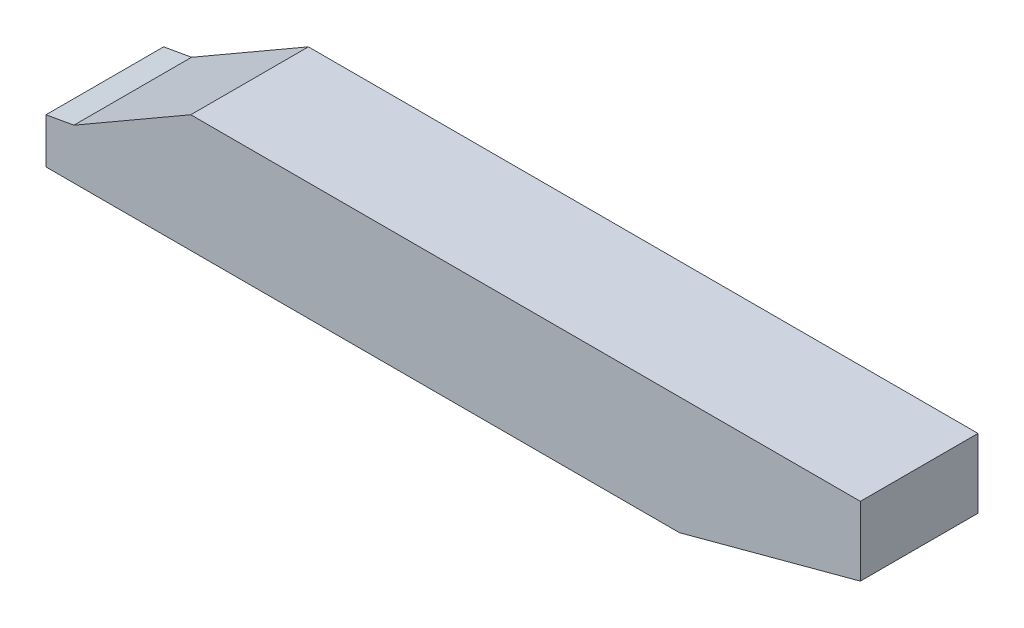
ISO-10303-21;
HEADER;
FILE_DESCRIPTION(('STEP AP214'),'2;1');
FILE_NAME('part.step','',(''),(''),'','','');
FILE_SCHEMA(('AUTOMOTIVE_DESIGN { 1 0 10303 214 1 1 1 1 }'));
ENDSEC;
DATA;
#1=APPLICATION_CONTEXT('core data for automotive mechanical design processes');
#2=APPLICATION_PROTOCOL_DEFINITION('international standard','automotive_design',2000,#1);
#3=PRODUCT_CONTEXT('',#1,'mechanical');
#4=PRODUCT('Part','Part','',(#3));
#5=PRODUCT_RELATED_PRODUCT_CATEGORY('part','',(#4));
#6=PRODUCT_DEFINITION_FORMATION('','',#4);
#7=PRODUCT_DEFINITION_CONTEXT('part definition',#1,'design');
#8=PRODUCT_DEFINITION('design','',#6,#7);
#9=PRODUCT_DEFINITION_SHAPE('','',#8);
#10=(LENGTH_UNIT() NAMED_UNIT(*) SI_UNIT(.MILLI.,.METRE.));
#11=(NAMED_UNIT(*) PLANE_ANGLE_UNIT() SI_UNIT($,.RADIAN.));
#12=(NAMED_UNIT(*) SI_UNIT($,.STERADIAN.) SOLID_ANGLE_UNIT());
#13=UNCERTAINTY_MEASURE_WITH_UNIT(LENGTH_MEASURE(1.E-05),#10,'distance_accuracy_value','');
#14=(GEOMETRIC_REPRESENTATION_CONTEXT(3) GLOBAL_UNCERTAINTY_ASSIGNED_CONTEXT((#13)) GLOBAL_UNIT_ASSIGNED_CONTEXT((#10,
#11,#12)) REPRESENTATION_CONTEXT('',''));
#15=CARTESIAN_POINT('',(0.,0.,0.));
#16=DIRECTION('',(0.,0.,1.));
#17=DIRECTION('',(1.,0.,0.));
#18=AXIS2_PLACEMENT_3D('',#15,#16,#17);
#19=CARTESIAN_POINT('',(700.,0.,65.));
#20=DIRECTION('',(0.,1.,0.));
#21=DIRECTION('',(0.,0.,1.));
#22=AXIS2_PLACEMENT_3D('',#19,#20,#21);
#23=PLANE('',#22);
#24=DIRECTION('',(1.,0.,0.));
#25=VECTOR('',#24,1.);
#26=CARTESIAN_POINT('',(700.,0.,-65.));
#27=LINE('',#26,#25);
#28=CARTESIAN_POINT('',(0.,0.,-65.));
#29=VERTEX_POINT('',#28);
#30=CARTESIAN_POINT('',(700.,0.,-65.));
#31=VERTEX_POINT('',#30);
#32=EDGE_CURVE('E199',#29,#31,#27,.T.);
#33=ORIENTED_EDGE('',*,*,#32,.T.);
#34=DIRECTION('',(0.,0.,-1.));
#35=VECTOR('',#34,1.);
#36=CARTESIAN_POINT('',(700.,0.,65.));
#37=LINE('',#36,#35);
#38=CARTESIAN_POINT('',(700.,0.,65.));
#39=VERTEX_POINT('',#38);
#40=EDGE_CURVE('E234',#39,#31,#37,.T.);
#41=ORIENTED_EDGE('',*,*,#40,.F.);
#42=DIRECTION('',(1.,0.,0.));
#43=VECTOR('',#42,1.);
#44=CARTESIAN_POINT('',(700.,0.,65.));
#45=LINE('',#44,#43);
#46=CARTESIAN_POINT('',(0.,0.,65.));
#47=VERTEX_POINT('',#46);
#48=EDGE_CURVE('E219',#47,#39,#45,.T.);
#49=ORIENTED_EDGE('',*,*,#48,.F.);
#50=DIRECTION('',(0.,0.,-1.));
#51=VECTOR('',#50,1.);
#52=CARTESIAN_POINT('',(0.,0.,65.));
#53=LINE('',#52,#51);
#54=EDGE_CURVE('E195',#47,#29,#53,.T.);
#55=ORIENTED_EDGE('',*,*,#54,.T.);
#56=EDGE_LOOP('',(#33,#41,#49,#55));
#57=FACE_BOUND('',#56,.T.);
#58=ADVANCED_FACE('F47',(#57),#23,.F.);
#59=CARTESIAN_POINT('',(700.,0.,65.));
#60=DIRECTION('',(-0.258819045102522,0.965925826289068,0.));
#61=DIRECTION('',(-0.965925826289068,-0.258819045102522,0.));
#62=AXIS2_PLACEMENT_3D('',#59,#60,#61);
#63=PLANE('',#62);
#64=DIRECTION('',(0.965925826289068,0.258819045102522,0.));
#65=VECTOR('',#64,1.);
#66=CARTESIAN_POINT('',(700.,0.,-65.));
#67=LINE('',#66,#65);
#68=CARTESIAN_POINT('',(900.,53.5898384862247,-65.));
#69=VERTEX_POINT('',#68);
#70=EDGE_CURVE('E203',#31,#69,#67,.T.);
#71=ORIENTED_EDGE('',*,*,#70,.T.);
#72=DIRECTION('',(0.,0.,-1.));
#73=VECTOR('',#72,1.);
#74=CARTESIAN_POINT('',(900.,53.5898384862247,65.));
#75=LINE('',#74,#73);
#76=CARTESIAN_POINT('',(900.,53.5898384862247,65.));
#77=VERTEX_POINT('',#76);
#78=EDGE_CURVE('E230',#77,#69,#75,.T.);
#79=ORIENTED_EDGE('',*,*,#78,.F.);
#80=DIRECTION('',(0.965925826289068,0.258819045102522,0.));
#81=VECTOR('',#80,1.);
#82=CARTESIAN_POINT('',(700.,0.,65.));
#83=LINE('',#82,#81);
#84=EDGE_CURVE('E161',#39,#77,#83,.T.);
#85=ORIENTED_EDGE('',*,*,#84,.F.);
#86=ORIENTED_EDGE('',*,*,#40,.T.);
#87=EDGE_LOOP('',(#71,#79,#85,#86));
#88=FACE_BOUND('',#87,.T.);
#89=ADVANCED_FACE('F336',(#88),#63,.F.);
#90=CARTESIAN_POINT('',(900.,130.,65.));
#91=DIRECTION('',(-1.,0.,0.));
#92=DIRECTION('',(0.,-1.,0.));
#93=AXIS2_PLACEMENT_3D('',#90,#91,#92);
#94=PLANE('',#93);
#95=DIRECTION('',(0.,1.,0.));
#96=VECTOR('',#95,1.);
#97=CARTESIAN_POINT('',(900.,130.,-65.));
#98=LINE('',#97,#96);
#99=CARTESIAN_POINT('',(900.,130.,-65.));
#100=VERTEX_POINT('',#99);
#101=EDGE_CURVE('E207',#69,#100,#98,.T.);
#102=ORIENTED_EDGE('',*,*,#101,.T.);
#103=DIRECTION('',(0.,0.,-1.));
#104=VECTOR('',#103,1.);
#105=CARTESIAN_POINT('',(900.,130.,65.));
#106=LINE('',#105,#104);
#107=CARTESIAN_POINT('',(900.,130.,65.));
#108=VERTEX_POINT('',#107);
#109=EDGE_CURVE('E226',#108,#100,#106,.T.);
#110=ORIENTED_EDGE('',*,*,#109,.F.);
#111=DIRECTION('',(0.,1.,0.));
#112=VECTOR('',#111,1.);
#113=CARTESIAN_POINT('',(900.,130.,65.));
#114=LINE('',#113,#112);
#115=EDGE_CURVE('E503',#77,#108,#114,.T.);
#116=ORIENTED_EDGE('',*,*,#115,.F.);
#117=ORIENTED_EDGE('',*,*,#78,.T.);
#118=EDGE_LOOP('',(#102,#110,#116,#117));
#119=FACE_BOUND('',#118,.T.);
#120=ADVANCED_FACE('F342',(#119),#94,.F.);
#121=CARTESIAN_POINT('',(160.,130.,65.));
#122=DIRECTION('',(0.,-1.,0.));
#123=DIRECTION('',(0.,0.,-1.));
#124=AXIS2_PLACEMENT_3D('',#121,#122,#123);
#125=PLANE('',#124);
#126=DIRECTION('',(-1.,0.,0.));
#127=VECTOR('',#126,1.);
#128=CARTESIAN_POINT('',(160.,130.,-65.));
#129=LINE('',#128,#127);
#130=CARTESIAN_POINT('',(160.,130.,-65.));
#131=VERTEX_POINT('',#130);
#132=EDGE_CURVE('E210',#100,#131,#129,.T.);
#133=ORIENTED_EDGE('',*,*,#132,.T.);
#134=DIRECTION('',(0.,0.,-1.));
#135=VECTOR('',#134,1.);
#136=CARTESIAN_POINT('',(160.,130.,65.));
#137=LINE('',#136,#135);
#138=CARTESIAN_POINT('',(160.,130.,65.));
#139=VERTEX_POINT('',#138);
#140=EDGE_CURVE('E188',#139,#131,#137,.T.);
#141=ORIENTED_EDGE('',*,*,#140,.F.);
#142=DIRECTION('',(-1.,0.,0.));
#143=VECTOR('',#142,1.);
#144=CARTESIAN_POINT('',(160.,130.,65.));
#145=LINE('',#144,#143);
#146=EDGE_CURVE('E177',#108,#139,#145,.T.);
#147=ORIENTED_EDGE('',*,*,#146,.F.);
#148=ORIENTED_EDGE('',*,*,#109,.T.);
#149=EDGE_LOOP('',(#133,#141,#147,#148));
#150=FACE_BOUND('',#149,.T.);
#151=ADVANCED_FACE('F455',(#150),#125,.F.);
#152=CARTESIAN_POINT('',(30.8611580070911,55.4416548125573,65.));
#153=DIRECTION('',(0.500000000000001,-0.866025403784438,0.));
#154=DIRECTION('',(0.866025403784438,0.500000000000001,0.));
#155=AXIS2_PLACEMENT_3D('',#152,#153,#154);
#156=PLANE('',#155);
#157=DIRECTION('',(-0.866025403784438,-0.500000000000001,0.));
#158=VECTOR('',#157,1.);
#159=CARTESIAN_POINT('',(30.8611580070911,55.4416548125573,-65.));
#160=LINE('',#159,#158);
#161=CARTESIAN_POINT('',(30.8611580070911,55.4416548125573,-65.));
#162=VERTEX_POINT('',#161);
#163=EDGE_CURVE('E186',#131,#162,#160,.T.);
#164=ORIENTED_EDGE('',*,*,#163,.T.);
#165=DIRECTION('',(0.,0.,-1.));
#166=VECTOR('',#165,1.);
#167=CARTESIAN_POINT('',(30.8611580070911,55.4416548125573,65.));
#168=LINE('',#167,#166);
#169=CARTESIAN_POINT('',(30.8611580070911,55.4416548125573,65.));
#170=VERTEX_POINT('',#169);
#171=EDGE_CURVE('E183',#170,#162,#168,.T.);
#172=ORIENTED_EDGE('',*,*,#171,.F.);
#173=DIRECTION('',(-0.866025403784438,-0.500000000000001,0.));
#174=VECTOR('',#173,1.);
#175=CARTESIAN_POINT('',(30.8611580070911,55.4416548125573,65.));
#176=LINE('',#175,#174);
#177=EDGE_CURVE('E171',#139,#170,#176,.T.);
#178=ORIENTED_EDGE('',*,*,#177,.F.);
#179=ORIENTED_EDGE('',*,*,#140,.T.);
#180=EDGE_LOOP('',(#164,#172,#178,#179));
#181=FACE_BOUND('',#180,.T.);
#182=ADVANCED_FACE('F184',(#181),#156,.F.);
#183=CARTESIAN_POINT('',(0.,50.,65.));
#184=DIRECTION('',(0.173648177666931,-0.984807753012208,0.));
#185=DIRECTION('',(0.984807753012208,0.173648177666931,0.));
#186=AXIS2_PLACEMENT_3D('',#183,#184,#185);
#187=PLANE('',#186);
#188=DIRECTION('',(-0.984807753012208,-0.173648177666931,0.));
#189=VECTOR('',#188,1.);
#190=CARTESIAN_POINT('',(0.,50.,-65.));
#191=LINE('',#190,#189);
#192=CARTESIAN_POINT('',(0.,50.,-65.));
#193=VERTEX_POINT('',#192);
#194=EDGE_CURVE('E146',#162,#193,#191,.T.);
#195=ORIENTED_EDGE('',*,*,#194,.T.);
#196=DIRECTION('',(0.,0.,-1.));
#197=VECTOR('',#196,1.);
#198=CARTESIAN_POINT('',(0.,50.,65.));
#199=LINE('',#198,#197);
#200=CARTESIAN_POINT('',(0.,50.,65.));
#201=VERTEX_POINT('',#200);
#202=EDGE_CURVE('E189',#201,#193,#199,.T.);
#203=ORIENTED_EDGE('',*,*,#202,.F.);
#204=DIRECTION('',(-0.984807753012208,-0.173648177666931,0.));
#205=VECTOR('',#204,1.);
#206=CARTESIAN_POINT('',(0.,50.,65.));
#207=LINE('',#206,#205);
#208=EDGE_CURVE('E175',#170,#201,#207,.T.);
#209=ORIENTED_EDGE('',*,*,#208,.F.);
#210=ORIENTED_EDGE('',*,*,#171,.T.);
#211=EDGE_LOOP('',(#195,#203,#209,#210));
#212=FACE_BOUND('',#211,.T.);
#213=ADVANCED_FACE('F191',(#212),#187,.F.);
#214=CARTESIAN_POINT('',(0.,0.,65.));
#215=DIRECTION('',(1.,0.,0.));
#216=DIRECTION('',(0.,0.,-1.));
#217=AXIS2_PLACEMENT_3D('',#214,#215,#216);
#218=PLANE('',#217);
#219=CARTESIAN_POINT('',(0.,25.,0.));
#220=DIRECTION('',(-1.,0.,0.));
#221=DIRECTION('',(0.,0.,1.));
#222=AXIS2_PLACEMENT_3D('',#219,#220,#221);
#223=CIRCLE('',#222,15.);
#224=CARTESIAN_POINT('',(1.11022302462516E-13,25.,15.));
#225=VERTEX_POINT('',#224);
#226=EDGE_CURVE('E204',#225,#225,#223,.T.);
#227=ORIENTED_EDGE('',*,*,#226,.F.);
#228=EDGE_LOOP('',(#227));
#229=FACE_BOUND('',#228,.T.);
#230=DIRECTION('',(0.,-1.,0.));
#231=VECTOR('',#230,1.);
#232=CARTESIAN_POINT('',(0.,0.,-65.));
#233=LINE('',#232,#231);
#234=EDGE_CURVE('E152',#193,#29,#233,.T.);
#235=ORIENTED_EDGE('',*,*,#234,.T.);
#236=ORIENTED_EDGE('',*,*,#54,.F.);
#237=DIRECTION('',(0.,-1.,0.));
#238=VECTOR('',#237,1.);
#239=CARTESIAN_POINT('',(0.,0.,65.));
#240=LINE('',#239,#238);
#241=EDGE_CURVE('E120',#201,#47,#240,.T.);
#242=ORIENTED_EDGE('',*,*,#241,.F.);
#243=ORIENTED_EDGE('',*,*,#202,.T.);
#244=EDGE_LOOP('',(#235,#236,#242,#243));
#245=FACE_BOUND('',#244,.T.);
#246=ADVANCED_FACE('F384',(#229,#245),#218,.F.);
#247=CARTESIAN_POINT('',(0.,0.,65.));
#248=DIRECTION('',(0.,0.,-1.));
#249=DIRECTION('',(-1.,0.,0.));
#250=AXIS2_PLACEMENT_3D('',#247,#248,#249);
#251=PLANE('',#250);
#252=ORIENTED_EDGE('',*,*,#48,.T.);
#253=ORIENTED_EDGE('',*,*,#84,.T.);
#254=ORIENTED_EDGE('',*,*,#115,.T.);
#255=ORIENTED_EDGE('',*,*,#146,.T.);
#256=ORIENTED_EDGE('',*,*,#177,.T.);
#257=ORIENTED_EDGE('',*,*,#208,.T.);
#258=ORIENTED_EDGE('',*,*,#241,.T.);
#259=EDGE_LOOP('',(#252,#253,#254,#255,#256,#257,#258));
#260=FACE_BOUND('',#259,.T.);
#261=ADVANCED_FACE('F173',(#260),#251,.F.);
#262=CARTESIAN_POINT('',(0.,0.,-65.));
#263=DIRECTION('',(0.,0.,-1.));
#264=DIRECTION('',(-1.,0.,0.));
#265=AXIS2_PLACEMENT_3D('',#262,#263,#264);
#266=PLANE('',#265);
#267=ORIENTED_EDGE('',*,*,#32,.F.);
#268=ORIENTED_EDGE('',*,*,#234,.F.);
#269=ORIENTED_EDGE('',*,*,#194,.F.);
#270=ORIENTED_EDGE('',*,*,#163,.F.);
#271=ORIENTED_EDGE('',*,*,#132,.F.);
#272=ORIENTED_EDGE('',*,*,#101,.F.);
#273=ORIENTED_EDGE('',*,*,#70,.F.);
#274=EDGE_LOOP('',(#267,#268,#269,#270,#271,#272,#273));
#275=FACE_BOUND('',#274,.T.);
#276=ADVANCED_FACE('F395',(#275),#266,.T.);
#277=CARTESIAN_POINT('',(900.001,25.,0.));
#278=DIRECTION('',(-1.,0.,0.));
#279=DIRECTION('',(0.,0.,1.));
#280=AXIS2_PLACEMENT_3D('',#277,#278,#279);
#281=CYLINDRICAL_SURFACE('',#280,15.);
#282=CARTESIAN_POINT('',(3.,25.,0.));
#283=DIRECTION('',(1.,0.,0.));
#284=DIRECTION('',(0.,0.,-1.));
#285=AXIS2_PLACEMENT_3D('',#282,#283,#284);
#286=CIRCLE('',#285,15.);
#287=CARTESIAN_POINT('',(3.,25.,15.));
#288=VERTEX_POINT('',#287);
#289=EDGE_CURVE('E506',#288,#288,#286,.F.);
#290=CARTESIAN_POINT('',(3.,25.,15.));
#291=CARTESIAN_POINT('',(2.96875,25.,15.));
#292=CARTESIAN_POINT('',(2.9375,25.,15.));
#293=CARTESIAN_POINT('',(2.875,25.,15.));
#294=CARTESIAN_POINT('',(2.84375,25.,15.));
#295=CARTESIAN_POINT('',(2.78124999999999,25.,15.));
#296=CARTESIAN_POINT('',(2.74999999999999,25.,15.));
#297=CARTESIAN_POINT('',(2.68749999999999,25.,15.));
#298=CARTESIAN_POINT('',(2.65624999999999,25.,15.));
#299=CARTESIAN_POINT('',(2.59374999999999,25.,15.));
#300=CARTESIAN_POINT('',(2.56249999999999,25.,15.));
#301=CARTESIAN_POINT('',(2.49999999999998,25.,15.));
#302=CARTESIAN_POINT('',(2.46874999999998,25.,15.));
#303=CARTESIAN_POINT('',(2.40624999999998,25.,15.));
#304=CARTESIAN_POINT('',(2.37499999999998,25.,15.));
#305=CARTESIAN_POINT('',(2.31249999999998,25.,15.));
#306=CARTESIAN_POINT('',(2.28124999999998,25.,15.));
#307=CARTESIAN_POINT('',(2.21875000000001,25.,15.));
#308=CARTESIAN_POINT('',(2.18750000000005,25.,15.));
#309=CARTESIAN_POINT('',(2.12500000000008,25.,15.));
#310=CARTESIAN_POINT('',(2.09375000000008,25.,15.));
#311=CARTESIAN_POINT('',(2.03125000000008,25.,15.));
#312=CARTESIAN_POINT('',(2.00000000000008,25.,15.));
#313=CARTESIAN_POINT('',(1.93750000000007,25.,15.));
#314=CARTESIAN_POINT('',(1.90625000000007,25.,15.));
#315=CARTESIAN_POINT('',(1.84375000000007,25.,15.));
#316=CARTESIAN_POINT('',(1.81250000000007,25.,15.));
#317=CARTESIAN_POINT('',(1.75000000000007,25.,15.));
#318=CARTESIAN_POINT('',(1.71875000000007,25.,15.));
#319=CARTESIAN_POINT('',(1.65625000000006,25.,15.));
#320=CARTESIAN_POINT('',(1.62500000000006,25.,15.));
#321=CARTESIAN_POINT('',(1.56250000000006,25.,15.));
#322=CARTESIAN_POINT('',(1.53125000000006,25.,15.));
#323=CARTESIAN_POINT('',(1.46875000000006,25.,15.));
#324=CARTESIAN_POINT('',(1.43750000000005,25.,15.));
#325=CARTESIAN_POINT('',(1.37500000000005,25.,15.));
#326=CARTESIAN_POINT('',(1.34375000000005,25.,15.));
#327=CARTESIAN_POINT('',(1.28125000000005,25.,15.));
#328=CARTESIAN_POINT('',(1.25000000000005,25.,15.));
#329=CARTESIAN_POINT('',(1.18750000000005,25.,15.));
#330=CARTESIAN_POINT('',(1.15625000000004,25.,15.));
#331=CARTESIAN_POINT('',(1.09375000000004,25.,15.));
#332=CARTESIAN_POINT('',(1.06250000000004,25.,15.));
#333=CARTESIAN_POINT('',(1.00000000000004,25.,15.));
#334=CARTESIAN_POINT('',(0.968750000000037,25.,15.));
#335=CARTESIAN_POINT('',(0.906250000000034,25.,15.));
#336=CARTESIAN_POINT('',(0.875000000000033,25.,15.));
#337=CARTESIAN_POINT('',(0.812500000000068,25.,15.));
#338=CARTESIAN_POINT('',(0.781250000000104,25.,15.));
#339=CARTESIAN_POINT('',(0.718750000000138,25.,15.));
#340=CARTESIAN_POINT('',(0.687500000000137,25.,15.));
#341=CARTESIAN_POINT('',(0.625000000000135,25.,15.));
#342=CARTESIAN_POINT('',(0.593750000000134,25.,15.));
#343=CARTESIAN_POINT('',(0.531250000000131,25.,15.));
#344=CARTESIAN_POINT('',(0.50000000000013,25.,15.));
#345=CARTESIAN_POINT('',(0.437500000000128,25.,15.));
#346=CARTESIAN_POINT('',(0.406250000000126,25.,15.));
#347=CARTESIAN_POINT('',(0.343750000000124,25.,15.));
#348=CARTESIAN_POINT('',(0.312500000000123,25.,15.));
#349=CARTESIAN_POINT('',(0.250000000000121,25.,15.));
#350=CARTESIAN_POINT('',(0.218750000000119,25.,15.));
#351=CARTESIAN_POINT('',(0.156250000000117,25.,15.));
#352=CARTESIAN_POINT('',(0.125000000000116,25.,15.));
#353=CARTESIAN_POINT('',(0.0625000000001134,25.,15.));
#354=CARTESIAN_POINT('',(0.0312500000001122,25.,15.));
#355=CARTESIAN_POINT('',(1.11022302462516E-13,25.,15.));
#356=B_SPLINE_CURVE_WITH_KNOTS('',3,(#290,#291,#292,#293,#294,#295,#296,#297,#298,#299,#300,
#301,#302,#303,#304,#305,#306,#307,#308,#309,#310,#311,#312,#313,#314,#315,#316,#317,#318,#319,
#320,#321,#322,#323,#324,#325,#326,#327,#328,#329,#330,#331,#332,#333,#334,#335,#336,#337,#338,
#339,#340,#341,#342,#343,#344,#345,#346,#347,#348,#349,#350,#351,#352,#353,#354,#355),
.UNSPECIFIED.,.F.,.F.,(4,2,2,2,2,2,2,2,2,2,2,2,2,2,2,2,2,2,2,2,2,2,2,2,2,2,2,2,2,2,2,2,4),(0.,
0.0937500000000036,0.187500000000007,0.281250000000011,0.375000000000014,0.468750000000018,
0.562500000000021,0.656250000000025,0.750000000000028,0.843749999999921,0.937499999999925,
1.03124999999993,1.12499999999993,1.21874999999994,1.31249999999994,1.40624999999994,
1.49999999999995,1.59374999999995,1.68749999999995,1.78124999999996,1.87499999999996,
1.96874999999996,2.06249999999997,2.15624999999997,2.24999999999986,2.34374999999987,
2.43749999999987,2.53124999999987,2.62499999999988,2.71874999999988,2.81249999999988,
2.90624999999989,2.99999999999989),.UNSPECIFIED.);
#357=EDGE_CURVE('BSEAM348',#288,#225,#356,.T.);
#358=ORIENTED_EDGE('',*,*,#289,.F.);
#359=ORIENTED_EDGE('',*,*,#226,.T.);
#360=ORIENTED_EDGE('',*,*,#357,.T.);
#361=ORIENTED_EDGE('',*,*,#357,.F.);
#362=EDGE_LOOP('',(#358,#360,#359,#361));
#363=FACE_BOUND('',#362,.T.);
#364=ADVANCED_FACE('F348',(#363),#281,.F.);
#365=CARTESIAN_POINT('',(700.,3.,65.));
#366=DIRECTION('',(0.,1.,0.));
#367=DIRECTION('',(0.,0.,1.));
#368=AXIS2_PLACEMENT_3D('',#365,#366,#367);
#369=PLANE('',#368);
#370=DIRECTION('',(1.,0.,0.));
#371=VECTOR('',#370,1.);
#372=CARTESIAN_POINT('',(0.,3.,-62.));
#373=LINE('',#372,#371);
#374=CARTESIAN_POINT('',(3.,3.,-62.));
#375=VERTEX_POINT('',#374);
#376=CARTESIAN_POINT('',(699.605042507238,3.,-62.));
#377=VERTEX_POINT('',#376);
#378=EDGE_CURVE('E51',#375,#377,#373,.T.);
#379=ORIENTED_EDGE('',*,*,#378,.F.);
#380=DIRECTION('',(0.,0.,-1.));
#381=VECTOR('',#380,1.);
#382=CARTESIAN_POINT('',(3.,3.,65.));
#383=LINE('',#382,#381);
#384=CARTESIAN_POINT('',(3.,3.,62.));
#385=VERTEX_POINT('',#384);
#386=EDGE_CURVE('E291',#385,#375,#383,.T.);
#387=ORIENTED_EDGE('',*,*,#386,.F.);
#388=DIRECTION('',(1.,0.,0.));
#389=VECTOR('',#388,1.);
#390=CARTESIAN_POINT('',(0.,3.,62.));
#391=LINE('',#390,#389);
#392=CARTESIAN_POINT('',(699.605042507238,3.,62.));
#393=VERTEX_POINT('',#392);
#394=EDGE_CURVE('E250',#385,#393,#391,.T.);
#395=ORIENTED_EDGE('',*,*,#394,.T.);
#396=DIRECTION('',(0.,0.,-1.));
#397=VECTOR('',#396,1.);
#398=CARTESIAN_POINT('',(699.605042507238,3.,65.));
#399=LINE('',#398,#397);
#400=EDGE_CURVE('E287',#393,#377,#399,.T.);
#401=ORIENTED_EDGE('',*,*,#400,.T.);
#402=EDGE_LOOP('',(#379,#387,#395,#401));
#403=FACE_BOUND('',#402,.T.);
#404=ADVANCED_FACE('F300',(#403),#369,.T.);
#405=CARTESIAN_POINT('',(699.223542864692,2.8977774788672,65.));
#406=DIRECTION('',(-0.258819045102522,0.965925826289068,0.));
#407=DIRECTION('',(-0.965925826289068,-0.258819045102522,0.));
#408=AXIS2_PLACEMENT_3D('',#405,#406,#407);
#409=PLANE('',#408);
#410=DIRECTION('',(0.965925826289068,0.258819045102522,0.));
#411=VECTOR('',#410,1.);
#412=CARTESIAN_POINT('',(46.1146515401392,-172.102222521133,-62.));
#413=LINE('',#412,#411);
#414=CARTESIAN_POINT('',(897.,55.8918194501616,-62.));
#415=VERTEX_POINT('',#414);
#416=EDGE_CURVE('E67',#377,#415,#413,.T.);
#417=ORIENTED_EDGE('',*,*,#416,.F.);
#418=ORIENTED_EDGE('',*,*,#400,.F.);
#419=DIRECTION('',(0.965925826289068,0.258819045102522,0.));
#420=VECTOR('',#419,1.);
#421=CARTESIAN_POINT('',(46.1146515401392,-172.102222521133,62.));
#422=LINE('',#421,#420);
#423=CARTESIAN_POINT('',(897.,55.8918194501616,62.));
#424=VERTEX_POINT('',#423);
#425=EDGE_CURVE('E108',#393,#424,#422,.T.);
#426=ORIENTED_EDGE('',*,*,#425,.T.);
#427=DIRECTION('',(0.,0.,-1.));
#428=VECTOR('',#427,1.);
#429=CARTESIAN_POINT('',(897.,55.8918194501617,65.));
#430=LINE('',#429,#428);
#431=EDGE_CURVE('E281',#424,#415,#430,.T.);
#432=ORIENTED_EDGE('',*,*,#431,.T.);
#433=EDGE_LOOP('',(#417,#418,#426,#432));
#434=FACE_BOUND('',#433,.T.);
#435=ADVANCED_FACE('F301',(#434),#409,.T.);
#436=CARTESIAN_POINT('',(897.,130.,65.));
#437=DIRECTION('',(-1.,0.,0.));
#438=DIRECTION('',(0.,-1.,0.));
#439=AXIS2_PLACEMENT_3D('',#436,#437,#438);
#440=PLANE('',#439);
#441=DIRECTION('',(0.,1.,0.));
#442=VECTOR('',#441,1.);
#443=CARTESIAN_POINT('',(897.,1.30332148677533E-12,-62.));
#444=LINE('',#443,#442);
#445=CARTESIAN_POINT('',(897.,127.,-62.));
#446=VERTEX_POINT('',#445);
#447=EDGE_CURVE('E284',#415,#446,#444,.T.);
#448=ORIENTED_EDGE('',*,*,#447,.F.);
#449=ORIENTED_EDGE('',*,*,#431,.F.);
#450=DIRECTION('',(0.,1.,0.));
#451=VECTOR('',#450,1.);
#452=CARTESIAN_POINT('',(897.,1.30332148677533E-12,62.));
#453=LINE('',#452,#451);
#454=CARTESIAN_POINT('',(897.,127.,62.));
#455=VERTEX_POINT('',#454);
#456=EDGE_CURVE('E245',#424,#455,#453,.T.);
#457=ORIENTED_EDGE('',*,*,#456,.T.);
#458=DIRECTION('',(0.,0.,-1.));
#459=VECTOR('',#458,1.);
#460=CARTESIAN_POINT('',(897.,127.,65.));
#461=LINE('',#460,#459);
#462=EDGE_CURVE('E274',#455,#446,#461,.T.);
#463=ORIENTED_EDGE('',*,*,#462,.T.);
#464=EDGE_LOOP('',(#448,#449,#457,#463));
#465=FACE_BOUND('',#464,.T.);
#466=ADVANCED_FACE('F305',(#465),#440,.T.);
#467=CARTESIAN_POINT('',(160.,127.,65.));
#468=DIRECTION('',(0.,-1.,0.));
#469=DIRECTION('',(0.,0.,-1.));
#470=AXIS2_PLACEMENT_3D('',#467,#468,#469);
#471=PLANE('',#470);
#472=DIRECTION('',(-1.,0.,0.));
#473=VECTOR('',#472,1.);
#474=CARTESIAN_POINT('',(0.,127.,-62.));
#475=LINE('',#474,#473);
#476=CARTESIAN_POINT('',(160.803847577293,127.,-62.));
#477=VERTEX_POINT('',#476);
#478=EDGE_CURVE('E278',#446,#477,#475,.T.);
#479=ORIENTED_EDGE('',*,*,#478,.F.);
#480=ORIENTED_EDGE('',*,*,#462,.F.);
#481=DIRECTION('',(-1.,0.,0.));
#482=VECTOR('',#481,1.);
#483=CARTESIAN_POINT('',(0.,127.,62.));
#484=LINE('',#483,#482);
#485=CARTESIAN_POINT('',(160.803847577293,127.,62.));
#486=VERTEX_POINT('',#485);
#487=EDGE_CURVE('E242',#455,#486,#484,.T.);
#488=ORIENTED_EDGE('',*,*,#487,.T.);
#489=DIRECTION('',(0.,0.,-1.));
#490=VECTOR('',#489,1.);
#491=CARTESIAN_POINT('',(160.803847577293,127.,65.));
#492=LINE('',#491,#490);
#493=EDGE_CURVE('E267',#486,#477,#492,.T.);
#494=ORIENTED_EDGE('',*,*,#493,.T.);
#495=EDGE_LOOP('',(#479,#480,#488,#494));
#496=FACE_BOUND('',#495,.T.);
#497=ADVANCED_FACE('F314',(#496),#471,.T.);
#498=CARTESIAN_POINT('',(32.3611580070911,52.843578601204,65.));
#499=DIRECTION('',(0.500000000000001,-0.866025403784438,0.));
#500=DIRECTION('',(0.866025403784438,0.500000000000001,0.));
#501=AXIS2_PLACEMENT_3D('',#498,#499,#500);
#502=PLANE('',#501);
#503=DIRECTION('',(-0.866025403784438,-0.500000000000001,0.));
#504=VECTOR('',#503,1.);
#505=CARTESIAN_POINT('',(-14.7916512459884,25.6198914858914,-62.));
#506=LINE('',#505,#504);
#507=CARTESIAN_POINT('',(31.9030470730927,52.5790881301413,-62.));
#508=VERTEX_POINT('',#507);
#509=EDGE_CURVE('E271',#477,#508,#506,.T.);
#510=ORIENTED_EDGE('',*,*,#509,.F.);
#511=ORIENTED_EDGE('',*,*,#493,.F.);
#512=DIRECTION('',(-0.866025403784438,-0.500000000000001,0.));
#513=VECTOR('',#512,1.);
#514=CARTESIAN_POINT('',(-14.7916512459884,25.6198914858914,62.));
#515=LINE('',#514,#513);
#516=CARTESIAN_POINT('',(31.9030470730927,52.5790881301413,62.));
#517=VERTEX_POINT('',#516);
#518=EDGE_CURVE('E239',#486,#517,#515,.T.);
#519=ORIENTED_EDGE('',*,*,#518,.T.);
#520=DIRECTION('',(0.,0.,-1.));
#521=VECTOR('',#520,1.);
#522=CARTESIAN_POINT('',(31.9030470730927,52.5790881301413,65.));
#523=LINE('',#522,#521);
#524=EDGE_CURVE('E260',#517,#508,#523,.T.);
#525=ORIENTED_EDGE('',*,*,#524,.T.);
#526=EDGE_LOOP('',(#510,#511,#519,#525));
#527=FACE_BOUND('',#526,.T.);
#528=ADVANCED_FACE('F317',(#527),#502,.T.);
#529=CARTESIAN_POINT('',(0.520944533000794,47.0455767409634,65.));
#530=DIRECTION('',(0.173648177666931,-0.984807753012208,0.));
#531=DIRECTION('',(0.984807753012208,0.173648177666931,0.));
#532=AXIS2_PLACEMENT_3D('',#529,#530,#531);
#533=PLANE('',#532);
#534=DIRECTION('',(-0.984807753012208,-0.173648177666931,0.));
#535=VECTOR('',#534,1.);
#536=CARTESIAN_POINT('',(-8.02955905014097,45.5378922606111,-62.));
#537=LINE('',#536,#535);
#538=CARTESIAN_POINT('',(3.,47.4827011064682,-62.));
#539=VERTEX_POINT('',#538);
#540=EDGE_CURVE('E264',#508,#539,#537,.T.);
#541=ORIENTED_EDGE('',*,*,#540,.F.);
#542=ORIENTED_EDGE('',*,*,#524,.F.);
#543=DIRECTION('',(-0.984807753012208,-0.173648177666931,0.));
#544=VECTOR('',#543,1.);
#545=CARTESIAN_POINT('',(-8.02955905014097,45.5378922606111,62.));
#546=LINE('',#545,#544);
#547=CARTESIAN_POINT('',(3.,47.4827011064682,62.));
#548=VERTEX_POINT('',#547);
#549=EDGE_CURVE('E58',#517,#548,#546,.T.);
#550=ORIENTED_EDGE('',*,*,#549,.T.);
#551=DIRECTION('',(0.,0.,-1.));
#552=VECTOR('',#551,1.);
#553=CARTESIAN_POINT('',(3.,47.4827011064682,65.));
#554=LINE('',#553,#552);
#555=EDGE_CURVE('E253',#548,#539,#554,.T.);
#556=ORIENTED_EDGE('',*,*,#555,.T.);
#557=EDGE_LOOP('',(#541,#542,#550,#556));
#558=FACE_BOUND('',#557,.T.);
#559=ADVANCED_FACE('F322',(#558),#533,.T.);
#560=CARTESIAN_POINT('',(3.,0.,65.));
#561=DIRECTION('',(1.,0.,0.));
#562=DIRECTION('',(0.,0.,-1.));
#563=AXIS2_PLACEMENT_3D('',#560,#561,#562);
#564=PLANE('',#563);
#565=ORIENTED_EDGE('',*,*,#289,.T.);
#566=EDGE_LOOP('',(#565));
#567=FACE_BOUND('',#566,.T.);
#568=DIRECTION('',(0.,-1.,0.));
#569=VECTOR('',#568,1.);
#570=CARTESIAN_POINT('',(3.,0.,-62.));
#571=LINE('',#570,#569);
#572=EDGE_CURVE('E257',#539,#375,#571,.T.);
#573=ORIENTED_EDGE('',*,*,#572,.F.);
#574=ORIENTED_EDGE('',*,*,#555,.F.);
#575=DIRECTION('',(0.,-1.,0.));
#576=VECTOR('',#575,1.);
#577=CARTESIAN_POINT('',(3.,0.,62.));
#578=LINE('',#577,#576);
#579=EDGE_CURVE('E11',#548,#385,#578,.T.);
#580=ORIENTED_EDGE('',*,*,#579,.T.);
#581=ORIENTED_EDGE('',*,*,#386,.T.);
#582=EDGE_LOOP('',(#573,#574,#580,#581));
#583=FACE_BOUND('',#582,.T.);
#584=ADVANCED_FACE('F324',(#567,#583),#564,.T.);
#585=CARTESIAN_POINT('',(0.,0.,62.));
#586=DIRECTION('',(0.,0.,-1.));
#587=DIRECTION('',(-1.,0.,0.));
#588=AXIS2_PLACEMENT_3D('',#585,#586,#587);
#589=PLANE('',#588);
#590=ORIENTED_EDGE('',*,*,#394,.F.);
#591=ORIENTED_EDGE('',*,*,#579,.F.);
#592=ORIENTED_EDGE('',*,*,#549,.F.);
#593=ORIENTED_EDGE('',*,*,#518,.F.);
#594=ORIENTED_EDGE('',*,*,#487,.F.);
#595=ORIENTED_EDGE('',*,*,#456,.F.);
#596=ORIENTED_EDGE('',*,*,#425,.F.);
#597=EDGE_LOOP('',(#590,#591,#592,#593,#594,#595,#596));
#598=FACE_BOUND('',#597,.T.);
#599=ADVANCED_FACE('F308',(#598),#589,.T.);
#600=CARTESIAN_POINT('',(0.,0.,-62.));
#601=DIRECTION('',(0.,0.,-1.));
#602=DIRECTION('',(-1.,0.,0.));
#603=AXIS2_PLACEMENT_3D('',#600,#601,#602);
#604=PLANE('',#603);
#605=ORIENTED_EDGE('',*,*,#378,.T.);
#606=ORIENTED_EDGE('',*,*,#416,.T.);
#607=ORIENTED_EDGE('',*,*,#447,.T.);
#608=ORIENTED_EDGE('',*,*,#478,.T.);
#609=ORIENTED_EDGE('',*,*,#509,.T.);
#610=ORIENTED_EDGE('',*,*,#540,.T.);
#611=ORIENTED_EDGE('',*,*,#572,.T.);
#612=EDGE_LOOP('',(#605,#606,#607,#608,#609,#610,#611));
#613=FACE_BOUND('',#612,.T.);
#614=ADVANCED_FACE('F49',(#613),#604,.F.);
#615=CLOSED_SHELL('',(#58,#89,#120,#151,#182,#213,#246,#261,#276,#364,#404,#435,#466,#497,#528,
#559,#584,#599,#614));
#616=MANIFOLD_SOLID_BREP('B2',#615);
#617=ADVANCED_BREP_SHAPE_REPRESENTATION('',(#18,#616),#14);
#618=SHAPE_DEFINITION_REPRESENTATION(#9,#617);
ENDSEC;
END-ISO-10303-21;
